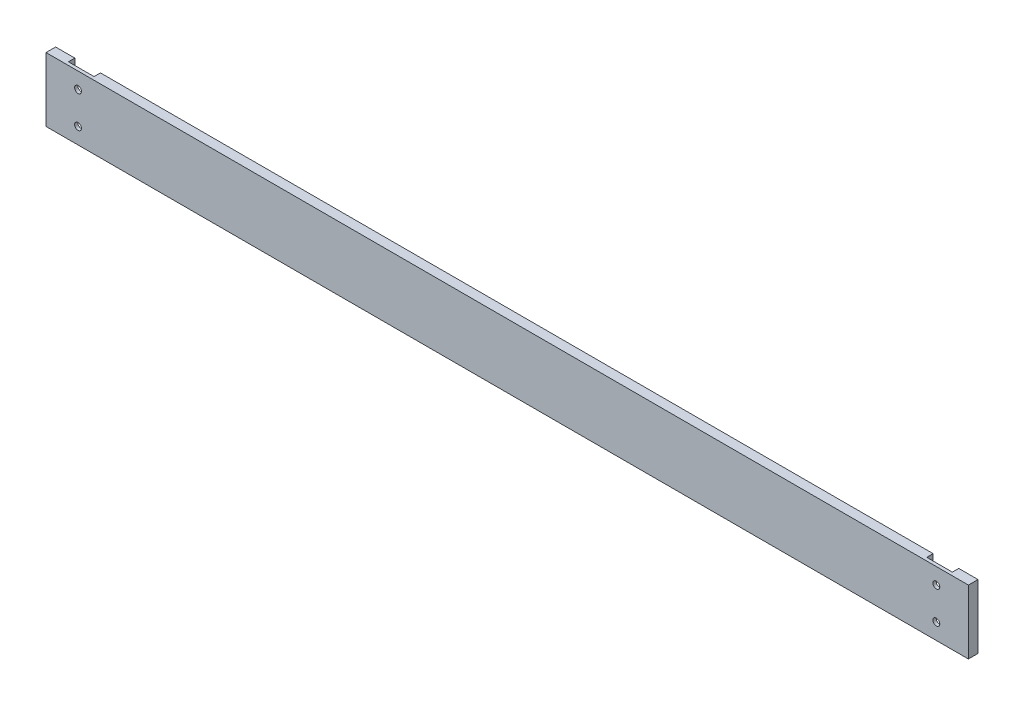
ISO-10303-21;
HEADER;
FILE_DESCRIPTION(('STEP AP214'),'2;1');
FILE_NAME('part.step','',(''),(''),'','','');
FILE_SCHEMA(('AUTOMOTIVE_DESIGN { 1 0 10303 214 1 1 1 1 }'));
ENDSEC;
DATA;
#1=APPLICATION_CONTEXT('core data for automotive mechanical design processes');
#2=APPLICATION_PROTOCOL_DEFINITION('international standard','automotive_design',2000,#1);
#3=PRODUCT_CONTEXT('',#1,'mechanical');
#4=PRODUCT('Part','Part','',(#3));
#5=PRODUCT_RELATED_PRODUCT_CATEGORY('part','',(#4));
#6=PRODUCT_DEFINITION_FORMATION('','',#4);
#7=PRODUCT_DEFINITION_CONTEXT('part definition',#1,'design');
#8=PRODUCT_DEFINITION('design','',#6,#7);
#9=PRODUCT_DEFINITION_SHAPE('','',#8);
#10=(LENGTH_UNIT() NAMED_UNIT(*) SI_UNIT(.MILLI.,.METRE.));
#11=(NAMED_UNIT(*) PLANE_ANGLE_UNIT() SI_UNIT($,.RADIAN.));
#12=(NAMED_UNIT(*) SI_UNIT($,.STERADIAN.) SOLID_ANGLE_UNIT());
#13=UNCERTAINTY_MEASURE_WITH_UNIT(LENGTH_MEASURE(1.E-05),#10,'distance_accuracy_value','');
#14=(GEOMETRIC_REPRESENTATION_CONTEXT(3) GLOBAL_UNCERTAINTY_ASSIGNED_CONTEXT((#13)) GLOBAL_UNIT_ASSIGNED_CONTEXT((#10,
#11,#12)) REPRESENTATION_CONTEXT('',''));
#15=CARTESIAN_POINT('',(0.,0.,0.));
#16=DIRECTION('',(0.,0.,1.));
#17=DIRECTION('',(1.,0.,0.));
#18=AXIS2_PLACEMENT_3D('',#15,#16,#17);
#19=CARTESIAN_POINT('',(-457.2,63.5,-9.52500000000001));
#20=DIRECTION('',(0.,0.,-1.));
#21=DIRECTION('',(-1.,0.,0.));
#22=AXIS2_PLACEMENT_3D('',#19,#20,#21);
#23=PLANE('',#22);
#24=DIRECTION('',(1.,0.,0.));
#25=VECTOR('',#24,1.);
#26=CARTESIAN_POINT('',(-457.2,0.,-9.52500000000001));
#27=LINE('',#26,#25);
#28=CARTESIAN_POINT('',(-412.75,0.,-9.525));
#29=VERTEX_POINT('',#28);
#30=CARTESIAN_POINT('',(412.75,0.,-9.525));
#31=VERTEX_POINT('',#30);
#32=EDGE_CURVE('E221',#29,#31,#27,.T.);
#33=ORIENTED_EDGE('',*,*,#32,.F.);
#34=DIRECTION('',(0.,1.,0.));
#35=VECTOR('',#34,1.);
#36=CARTESIAN_POINT('',(-412.75,0.,-9.525));
#37=LINE('',#36,#35);
#38=CARTESIAN_POINT('',(-412.75,63.5,-9.525));
#39=VERTEX_POINT('',#38);
#40=EDGE_CURVE('E256',#29,#39,#37,.T.);
#41=ORIENTED_EDGE('',*,*,#40,.T.);
#42=DIRECTION('',(1.,0.,0.));
#43=VECTOR('',#42,1.);
#44=CARTESIAN_POINT('',(-457.2,63.5,-9.52500000000001));
#45=LINE('',#44,#43);
#46=CARTESIAN_POINT('',(412.75,63.5,-9.525));
#47=VERTEX_POINT('',#46);
#48=EDGE_CURVE('E211',#39,#47,#45,.T.);
#49=ORIENTED_EDGE('',*,*,#48,.T.);
#50=DIRECTION('',(0.,1.,0.));
#51=VECTOR('',#50,1.);
#52=CARTESIAN_POINT('',(412.75,0.,-9.525));
#53=LINE('',#52,#51);
#54=EDGE_CURVE('E173',#31,#47,#53,.T.);
#55=ORIENTED_EDGE('',*,*,#54,.F.);
#56=EDGE_LOOP('',(#33,#41,#49,#55));
#57=FACE_BOUND('',#56,.T.);
#58=ADVANCED_FACE('F38',(#57),#23,.T.);
#59=CARTESIAN_POINT('',(-457.2,63.5,-9.52500000000001));
#60=VERTEX_POINT('',#59);
#61=CARTESIAN_POINT('',(-438.15,63.5,-9.525));
#62=VERTEX_POINT('',#61);
#63=EDGE_CURVE('E207',#60,#62,#45,.T.);
#64=ORIENTED_EDGE('',*,*,#63,.T.);
#65=DIRECTION('',(0.,-1.,0.));
#66=VECTOR('',#65,1.);
#67=CARTESIAN_POINT('',(-438.15,0.,-9.525));
#68=LINE('',#67,#66);
#69=CARTESIAN_POINT('',(-438.15,0.,-9.525));
#70=VERTEX_POINT('',#69);
#71=EDGE_CURVE('E238',#62,#70,#68,.T.);
#72=ORIENTED_EDGE('',*,*,#71,.T.);
#73=CARTESIAN_POINT('',(-457.2,0.,-9.52500000000001));
#74=VERTEX_POINT('',#73);
#75=EDGE_CURVE('E151',#74,#70,#27,.T.);
#76=ORIENTED_EDGE('',*,*,#75,.F.);
#77=DIRECTION('',(0.,-1.,0.));
#78=VECTOR('',#77,1.);
#79=CARTESIAN_POINT('',(-457.2,63.5,-9.52500000000001));
#80=LINE('',#79,#78);
#81=EDGE_CURVE('E42',#60,#74,#80,.T.);
#82=ORIENTED_EDGE('',*,*,#81,.F.);
#83=EDGE_LOOP('',(#64,#72,#76,#82));
#84=FACE_BOUND('',#83,.T.);
#85=ADVANCED_FACE('F237',(#84),#23,.T.);
#86=CARTESIAN_POINT('',(0.,63.5,0.));
#87=DIRECTION('',(0.,-1.,0.));
#88=DIRECTION('',(0.,0.,-1.));
#89=AXIS2_PLACEMENT_3D('',#86,#87,#88);
#90=PLANE('',#89);
#91=DIRECTION('',(0.,0.,-1.));
#92=VECTOR('',#91,1.);
#93=CARTESIAN_POINT('',(-412.75,63.5,-3.175));
#94=LINE('',#93,#92);
#95=CARTESIAN_POINT('',(-412.75,63.5,-3.175));
#96=VERTEX_POINT('',#95);
#97=EDGE_CURVE('E154',#96,#39,#94,.T.);
#98=ORIENTED_EDGE('',*,*,#97,.F.);
#99=DIRECTION('',(-1.,0.,0.));
#100=VECTOR('',#99,1.);
#101=CARTESIAN_POINT('',(-412.75,63.5,-3.175));
#102=LINE('',#101,#100);
#103=CARTESIAN_POINT('',(-438.15,63.5,-3.175));
#104=VERTEX_POINT('',#103);
#105=EDGE_CURVE('E139',#96,#104,#102,.T.);
#106=ORIENTED_EDGE('',*,*,#105,.T.);
#107=DIRECTION('',(0.,0.,-1.));
#108=VECTOR('',#107,1.);
#109=CARTESIAN_POINT('',(-438.15,63.5,-3.175));
#110=LINE('',#109,#108);
#111=EDGE_CURVE('E137',#104,#62,#110,.T.);
#112=ORIENTED_EDGE('',*,*,#111,.T.);
#113=ORIENTED_EDGE('',*,*,#63,.F.);
#114=DIRECTION('',(0.,0.,-1.));
#115=VECTOR('',#114,1.);
#116=CARTESIAN_POINT('',(-457.2,63.5,0.));
#117=LINE('',#116,#115);
#118=CARTESIAN_POINT('',(-457.2,63.5,0.));
#119=VERTEX_POINT('',#118);
#120=EDGE_CURVE('E202',#119,#60,#117,.T.);
#121=ORIENTED_EDGE('',*,*,#120,.F.);
#122=DIRECTION('',(1.,0.,0.));
#123=VECTOR('',#122,1.);
#124=CARTESIAN_POINT('',(-457.2,63.5,0.));
#125=LINE('',#124,#123);
#126=CARTESIAN_POINT('',(457.2,63.5,0.));
#127=VERTEX_POINT('',#126);
#128=EDGE_CURVE('E214',#119,#127,#125,.T.);
#129=ORIENTED_EDGE('',*,*,#128,.T.);
#130=DIRECTION('',(0.,0.,-1.));
#131=VECTOR('',#130,1.);
#132=CARTESIAN_POINT('',(457.2,63.5,0.));
#133=LINE('',#132,#131);
#134=CARTESIAN_POINT('',(457.2,63.5,-9.52500000000001));
#135=VERTEX_POINT('',#134);
#136=EDGE_CURVE('E210',#127,#135,#133,.T.);
#137=ORIENTED_EDGE('',*,*,#136,.T.);
#138=CARTESIAN_POINT('',(438.15,63.5,-9.525));
#139=VERTEX_POINT('',#138);
#140=EDGE_CURVE('E205',#139,#135,#45,.T.);
#141=ORIENTED_EDGE('',*,*,#140,.F.);
#142=DIRECTION('',(0.,0.,-1.));
#143=VECTOR('',#142,1.);
#144=CARTESIAN_POINT('',(438.15,63.5,-3.175));
#145=LINE('',#144,#143);
#146=CARTESIAN_POINT('',(438.15,63.5,-3.175));
#147=VERTEX_POINT('',#146);
#148=EDGE_CURVE('E197',#147,#139,#145,.T.);
#149=ORIENTED_EDGE('',*,*,#148,.F.);
#150=DIRECTION('',(1.,0.,0.));
#151=VECTOR('',#150,1.);
#152=CARTESIAN_POINT('',(412.75,63.5,-3.175));
#153=LINE('',#152,#151);
#154=CARTESIAN_POINT('',(412.75,63.5,-3.175));
#155=VERTEX_POINT('',#154);
#156=EDGE_CURVE('E178',#155,#147,#153,.T.);
#157=ORIENTED_EDGE('',*,*,#156,.F.);
#158=DIRECTION('',(0.,0.,-1.));
#159=VECTOR('',#158,1.);
#160=CARTESIAN_POINT('',(412.75,63.5,-3.175));
#161=LINE('',#160,#159);
#162=EDGE_CURVE('E185',#155,#47,#161,.T.);
#163=ORIENTED_EDGE('',*,*,#162,.T.);
#164=ORIENTED_EDGE('',*,*,#48,.F.);
#165=EDGE_LOOP('',(#98,#106,#112,#113,#121,#129,#137,#141,#149,#157,#163,#164));
#166=FACE_BOUND('',#165,.T.);
#167=ADVANCED_FACE('F251',(#166),#90,.F.);
#168=CARTESIAN_POINT('',(0.,0.,0.));
#169=DIRECTION('',(0.,-1.,0.));
#170=DIRECTION('',(0.,0.,-1.));
#171=AXIS2_PLACEMENT_3D('',#168,#169,#170);
#172=PLANE('',#171);
#173=DIRECTION('',(1.,0.,0.));
#174=VECTOR('',#173,1.);
#175=CARTESIAN_POINT('',(-412.75,0.,-3.175));
#176=LINE('',#175,#174);
#177=CARTESIAN_POINT('',(-438.15,0.,-3.175));
#178=VERTEX_POINT('',#177);
#179=CARTESIAN_POINT('',(-412.75,0.,-3.175));
#180=VERTEX_POINT('',#179);
#181=EDGE_CURVE('E140',#178,#180,#176,.T.);
#182=ORIENTED_EDGE('',*,*,#181,.T.);
#183=DIRECTION('',(0.,0.,-1.));
#184=VECTOR('',#183,1.);
#185=CARTESIAN_POINT('',(-412.75,0.,-3.175));
#186=LINE('',#185,#184);
#187=EDGE_CURVE('E152',#180,#29,#186,.T.);
#188=ORIENTED_EDGE('',*,*,#187,.T.);
#189=ORIENTED_EDGE('',*,*,#32,.T.);
#190=DIRECTION('',(0.,0.,-1.));
#191=VECTOR('',#190,1.);
#192=CARTESIAN_POINT('',(412.75,0.,-3.175));
#193=LINE('',#192,#191);
#194=CARTESIAN_POINT('',(412.75,0.,-3.175));
#195=VERTEX_POINT('',#194);
#196=EDGE_CURVE('E190',#195,#31,#193,.T.);
#197=ORIENTED_EDGE('',*,*,#196,.F.);
#198=DIRECTION('',(-1.,0.,0.));
#199=VECTOR('',#198,1.);
#200=CARTESIAN_POINT('',(412.75,0.,-3.175));
#201=LINE('',#200,#199);
#202=CARTESIAN_POINT('',(438.15,0.,-3.175));
#203=VERTEX_POINT('',#202);
#204=EDGE_CURVE('E183',#203,#195,#201,.T.);
#205=ORIENTED_EDGE('',*,*,#204,.F.);
#206=DIRECTION('',(0.,0.,-1.));
#207=VECTOR('',#206,1.);
#208=CARTESIAN_POINT('',(438.15,0.,-3.175));
#209=LINE('',#208,#207);
#210=CARTESIAN_POINT('',(438.15,0.,-9.525));
#211=VERTEX_POINT('',#210);
#212=EDGE_CURVE('E194',#203,#211,#209,.T.);
#213=ORIENTED_EDGE('',*,*,#212,.T.);
#214=CARTESIAN_POINT('',(457.2,0.,-9.52500000000001));
#215=VERTEX_POINT('',#214);
#216=EDGE_CURVE('E218',#211,#215,#27,.T.);
#217=ORIENTED_EDGE('',*,*,#216,.T.);
#218=DIRECTION('',(0.,0.,-1.));
#219=VECTOR('',#218,1.);
#220=CARTESIAN_POINT('',(457.2,0.,0.));
#221=LINE('',#220,#219);
#222=CARTESIAN_POINT('',(457.2,0.,0.));
#223=VERTEX_POINT('',#222);
#224=EDGE_CURVE('E220',#223,#215,#221,.T.);
#225=ORIENTED_EDGE('',*,*,#224,.F.);
#226=DIRECTION('',(1.,0.,0.));
#227=VECTOR('',#226,1.);
#228=CARTESIAN_POINT('',(-457.2,0.,0.));
#229=LINE('',#228,#227);
#230=CARTESIAN_POINT('',(-457.2,0.,0.));
#231=VERTEX_POINT('',#230);
#232=EDGE_CURVE('E206',#231,#223,#229,.T.);
#233=ORIENTED_EDGE('',*,*,#232,.F.);
#234=DIRECTION('',(0.,0.,-1.));
#235=VECTOR('',#234,1.);
#236=CARTESIAN_POINT('',(-457.2,0.,0.));
#237=LINE('',#236,#235);
#238=EDGE_CURVE('E193',#231,#74,#237,.T.);
#239=ORIENTED_EDGE('',*,*,#238,.T.);
#240=ORIENTED_EDGE('',*,*,#75,.T.);
#241=DIRECTION('',(0.,0.,-1.));
#242=VECTOR('',#241,1.);
#243=CARTESIAN_POINT('',(-438.15,0.,-3.175));
#244=LINE('',#243,#242);
#245=EDGE_CURVE('E134',#178,#70,#244,.T.);
#246=ORIENTED_EDGE('',*,*,#245,.F.);
#247=EDGE_LOOP('',(#182,#188,#189,#197,#205,#213,#217,#225,#233,#239,#240,#246));
#248=FACE_BOUND('',#247,.T.);
#249=ADVANCED_FACE('F148',(#248),#172,.T.);
#250=CARTESIAN_POINT('',(-457.2,63.5,0.));
#251=DIRECTION('',(-1.,0.,0.));
#252=DIRECTION('',(0.,0.,1.));
#253=AXIS2_PLACEMENT_3D('',#250,#251,#252);
#254=PLANE('',#253);
#255=ORIENTED_EDGE('',*,*,#238,.F.);
#256=DIRECTION('',(0.,-1.,0.));
#257=VECTOR('',#256,1.);
#258=CARTESIAN_POINT('',(-457.2,63.5,0.));
#259=LINE('',#258,#257);
#260=EDGE_CURVE('E11',#119,#231,#259,.T.);
#261=ORIENTED_EDGE('',*,*,#260,.F.);
#262=ORIENTED_EDGE('',*,*,#120,.T.);
#263=ORIENTED_EDGE('',*,*,#81,.T.);
#264=EDGE_LOOP('',(#255,#261,#262,#263));
#265=FACE_BOUND('',#264,.T.);
#266=ADVANCED_FACE('F40',(#265),#254,.T.);
#267=CARTESIAN_POINT('',(-457.2,63.5,0.));
#268=DIRECTION('',(0.,0.,-1.));
#269=DIRECTION('',(-1.,0.,0.));
#270=AXIS2_PLACEMENT_3D('',#267,#268,#269);
#271=PLANE('',#270);
#272=CARTESIAN_POINT('',(-425.45,15.875,0.));
#273=DIRECTION('',(0.,0.,1.));
#274=DIRECTION('',(1.,0.,0.));
#275=AXIS2_PLACEMENT_3D('',#272,#273,#274);
#276=CIRCLE('',#275,3.3782);
#277=CARTESIAN_POINT('',(-422.0718,15.875,0.));
#278=VERTEX_POINT('',#277);
#279=EDGE_CURVE('E424',#278,#278,#276,.T.);
#280=ORIENTED_EDGE('',*,*,#279,.F.);
#281=EDGE_LOOP('',(#280));
#282=FACE_BOUND('',#281,.T.);
#283=CARTESIAN_POINT('',(-425.45,47.625,0.));
#284=DIRECTION('',(0.,0.,1.));
#285=DIRECTION('',(1.,0.,0.));
#286=AXIS2_PLACEMENT_3D('',#283,#284,#285);
#287=CIRCLE('',#286,3.3782);
#288=CARTESIAN_POINT('',(-422.0718,47.625,0.));
#289=VERTEX_POINT('',#288);
#290=EDGE_CURVE('E428',#289,#289,#287,.T.);
#291=ORIENTED_EDGE('',*,*,#290,.F.);
#292=EDGE_LOOP('',(#291));
#293=FACE_BOUND('',#292,.T.);
#294=CARTESIAN_POINT('',(425.45,15.875,0.));
#295=DIRECTION('',(0.,0.,1.));
#296=DIRECTION('',(1.,0.,0.));
#297=AXIS2_PLACEMENT_3D('',#294,#295,#296);
#298=CIRCLE('',#297,3.3782);
#299=CARTESIAN_POINT('',(428.8282,15.875,0.));
#300=VERTEX_POINT('',#299);
#301=EDGE_CURVE('E159',#300,#300,#298,.T.);
#302=ORIENTED_EDGE('',*,*,#301,.F.);
#303=EDGE_LOOP('',(#302));
#304=FACE_BOUND('',#303,.T.);
#305=CARTESIAN_POINT('',(425.45,47.625,0.));
#306=DIRECTION('',(0.,0.,1.));
#307=DIRECTION('',(1.,0.,0.));
#308=AXIS2_PLACEMENT_3D('',#305,#306,#307);
#309=CIRCLE('',#308,3.3782);
#310=CARTESIAN_POINT('',(428.8282,47.625,0.));
#311=VERTEX_POINT('',#310);
#312=EDGE_CURVE('E165',#311,#311,#309,.T.);
#313=ORIENTED_EDGE('',*,*,#312,.F.);
#314=EDGE_LOOP('',(#313));
#315=FACE_BOUND('',#314,.T.);
#316=ORIENTED_EDGE('',*,*,#232,.T.);
#317=DIRECTION('',(0.,-1.,0.));
#318=VECTOR('',#317,1.);
#319=CARTESIAN_POINT('',(457.2,63.5,0.));
#320=LINE('',#319,#318);
#321=EDGE_CURVE('E47',#127,#223,#320,.T.);
#322=ORIENTED_EDGE('',*,*,#321,.F.);
#323=ORIENTED_EDGE('',*,*,#128,.F.);
#324=ORIENTED_EDGE('',*,*,#260,.T.);
#325=EDGE_LOOP('',(#316,#322,#323,#324));
#326=FACE_BOUND('',#325,.T.);
#327=ADVANCED_FACE('F243',(#282,#293,#304,#315,#326),#271,.F.);
#328=CARTESIAN_POINT('',(457.2,63.5,0.));
#329=DIRECTION('',(-1.,0.,0.));
#330=DIRECTION('',(0.,0.,1.));
#331=AXIS2_PLACEMENT_3D('',#328,#329,#330);
#332=PLANE('',#331);
#333=ORIENTED_EDGE('',*,*,#224,.T.);
#334=DIRECTION('',(0.,-1.,0.));
#335=VECTOR('',#334,1.);
#336=CARTESIAN_POINT('',(457.2,63.5,-9.52500000000001));
#337=LINE('',#336,#335);
#338=EDGE_CURVE('E227',#135,#215,#337,.T.);
#339=ORIENTED_EDGE('',*,*,#338,.F.);
#340=ORIENTED_EDGE('',*,*,#136,.F.);
#341=ORIENTED_EDGE('',*,*,#321,.T.);
#342=EDGE_LOOP('',(#333,#339,#340,#341));
#343=FACE_BOUND('',#342,.T.);
#344=ADVANCED_FACE('F247',(#343),#332,.F.);
#345=DIRECTION('',(0.,-1.,0.));
#346=VECTOR('',#345,1.);
#347=CARTESIAN_POINT('',(438.15,0.,-9.525));
#348=LINE('',#347,#346);
#349=EDGE_CURVE('E179',#139,#211,#348,.T.);
#350=ORIENTED_EDGE('',*,*,#349,.F.);
#351=ORIENTED_EDGE('',*,*,#140,.T.);
#352=ORIENTED_EDGE('',*,*,#338,.T.);
#353=ORIENTED_EDGE('',*,*,#216,.F.);
#354=EDGE_LOOP('',(#350,#351,#352,#353));
#355=FACE_BOUND('',#354,.T.);
#356=ADVANCED_FACE('F268',(#355),#23,.T.);
#357=CARTESIAN_POINT('',(412.75,0.,-3.175));
#358=DIRECTION('',(-1.,0.,0.));
#359=DIRECTION('',(0.,-1.,0.));
#360=AXIS2_PLACEMENT_3D('',#357,#358,#359);
#361=PLANE('',#360);
#362=ORIENTED_EDGE('',*,*,#54,.T.);
#363=ORIENTED_EDGE('',*,*,#162,.F.);
#364=DIRECTION('',(0.,1.,0.));
#365=VECTOR('',#364,1.);
#366=CARTESIAN_POINT('',(412.75,0.,-3.175));
#367=LINE('',#366,#365);
#368=EDGE_CURVE('E174',#195,#155,#367,.T.);
#369=ORIENTED_EDGE('',*,*,#368,.F.);
#370=ORIENTED_EDGE('',*,*,#196,.T.);
#371=EDGE_LOOP('',(#362,#363,#369,#370));
#372=FACE_BOUND('',#371,.T.);
#373=ADVANCED_FACE('F275',(#372),#361,.F.);
#374=CARTESIAN_POINT('',(438.15,0.,-3.175));
#375=DIRECTION('',(1.,0.,0.));
#376=DIRECTION('',(0.,0.,-1.));
#377=AXIS2_PLACEMENT_3D('',#374,#375,#376);
#378=PLANE('',#377);
#379=ORIENTED_EDGE('',*,*,#349,.T.);
#380=ORIENTED_EDGE('',*,*,#212,.F.);
#381=DIRECTION('',(0.,-1.,0.));
#382=VECTOR('',#381,1.);
#383=CARTESIAN_POINT('',(438.15,0.,-3.175));
#384=LINE('',#383,#382);
#385=EDGE_CURVE('E63',#147,#203,#384,.T.);
#386=ORIENTED_EDGE('',*,*,#385,.F.);
#387=ORIENTED_EDGE('',*,*,#148,.T.);
#388=EDGE_LOOP('',(#379,#380,#386,#387));
#389=FACE_BOUND('',#388,.T.);
#390=ADVANCED_FACE('F270',(#389),#378,.F.);
#391=CARTESIAN_POINT('',(0.,0.,-3.175));
#392=DIRECTION('',(0.,0.,-1.));
#393=DIRECTION('',(-1.,0.,0.));
#394=AXIS2_PLACEMENT_3D('',#391,#392,#393);
#395=PLANE('',#394);
#396=CARTESIAN_POINT('',(425.45,15.875,-3.175));
#397=DIRECTION('',(0.,0.,-1.));
#398=DIRECTION('',(-1.,0.,0.));
#399=AXIS2_PLACEMENT_3D('',#396,#397,#398);
#400=CIRCLE('',#399,3.3782);
#401=CARTESIAN_POINT('',(422.0718,15.875,-3.175));
#402=VERTEX_POINT('',#401);
#403=EDGE_CURVE('E162',#402,#402,#400,.T.);
#404=ORIENTED_EDGE('',*,*,#403,.F.);
#405=EDGE_LOOP('',(#404));
#406=FACE_BOUND('',#405,.T.);
#407=CARTESIAN_POINT('',(425.45,47.625,-3.175));
#408=DIRECTION('',(0.,0.,-1.));
#409=DIRECTION('',(-1.,0.,0.));
#410=AXIS2_PLACEMENT_3D('',#407,#408,#409);
#411=CIRCLE('',#410,3.3782);
#412=CARTESIAN_POINT('',(422.0718,47.625,-3.175));
#413=VERTEX_POINT('',#412);
#414=EDGE_CURVE('E169',#413,#413,#411,.T.);
#415=ORIENTED_EDGE('',*,*,#414,.F.);
#416=EDGE_LOOP('',(#415));
#417=FACE_BOUND('',#416,.T.);
#418=ORIENTED_EDGE('',*,*,#368,.T.);
#419=ORIENTED_EDGE('',*,*,#156,.T.);
#420=ORIENTED_EDGE('',*,*,#385,.T.);
#421=ORIENTED_EDGE('',*,*,#204,.T.);
#422=EDGE_LOOP('',(#418,#419,#420,#421));
#423=FACE_BOUND('',#422,.T.);
#424=ADVANCED_FACE('F273',(#406,#417,#423),#395,.T.);
#425=CARTESIAN_POINT('',(425.45,47.625,0.));
#426=DIRECTION('',(0.,0.,1.));
#427=DIRECTION('',(1.,0.,0.));
#428=AXIS2_PLACEMENT_3D('',#425,#426,#427);
#429=CYLINDRICAL_SURFACE('',#428,3.3782);
#430=ORIENTED_EDGE('',*,*,#312,.T.);
#431=EDGE_LOOP('',(#430));
#432=FACE_BOUND('',#431,.T.);
#433=ORIENTED_EDGE('',*,*,#414,.T.);
#434=EDGE_LOOP('',(#433));
#435=FACE_BOUND('',#434,.T.);
#436=ADVANCED_FACE('F337',(#432,#435),#429,.F.);
#437=CARTESIAN_POINT('',(425.45,15.875,0.));
#438=DIRECTION('',(0.,0.,1.));
#439=DIRECTION('',(1.,0.,0.));
#440=AXIS2_PLACEMENT_3D('',#437,#438,#439);
#441=CYLINDRICAL_SURFACE('',#440,3.3782);
#442=ORIENTED_EDGE('',*,*,#301,.T.);
#443=EDGE_LOOP('',(#442));
#444=FACE_BOUND('',#443,.T.);
#445=ORIENTED_EDGE('',*,*,#403,.T.);
#446=EDGE_LOOP('',(#445));
#447=FACE_BOUND('',#446,.T.);
#448=ADVANCED_FACE('F342',(#444,#447),#441,.F.);
#449=CARTESIAN_POINT('',(-412.75,0.,-3.175));
#450=DIRECTION('',(-1.,0.,0.));
#451=DIRECTION('',(0.,-1.,0.));
#452=AXIS2_PLACEMENT_3D('',#449,#450,#451);
#453=PLANE('',#452);
#454=ORIENTED_EDGE('',*,*,#40,.F.);
#455=ORIENTED_EDGE('',*,*,#187,.F.);
#456=DIRECTION('',(0.,1.,0.));
#457=VECTOR('',#456,1.);
#458=CARTESIAN_POINT('',(-412.75,0.,-3.175));
#459=LINE('',#458,#457);
#460=EDGE_CURVE('E55',#180,#96,#459,.T.);
#461=ORIENTED_EDGE('',*,*,#460,.T.);
#462=ORIENTED_EDGE('',*,*,#97,.T.);
#463=EDGE_LOOP('',(#454,#455,#461,#462));
#464=FACE_BOUND('',#463,.T.);
#465=ADVANCED_FACE('F261',(#464),#453,.T.);
#466=CARTESIAN_POINT('',(-438.15,0.,-3.175));
#467=DIRECTION('',(1.,0.,0.));
#468=DIRECTION('',(0.,0.,-1.));
#469=AXIS2_PLACEMENT_3D('',#466,#467,#468);
#470=PLANE('',#469);
#471=ORIENTED_EDGE('',*,*,#71,.F.);
#472=ORIENTED_EDGE('',*,*,#111,.F.);
#473=DIRECTION('',(0.,-1.,0.));
#474=VECTOR('',#473,1.);
#475=CARTESIAN_POINT('',(-438.15,0.,-3.175));
#476=LINE('',#475,#474);
#477=EDGE_CURVE('E131',#104,#178,#476,.T.);
#478=ORIENTED_EDGE('',*,*,#477,.T.);
#479=ORIENTED_EDGE('',*,*,#245,.T.);
#480=EDGE_LOOP('',(#471,#472,#478,#479));
#481=FACE_BOUND('',#480,.T.);
#482=ADVANCED_FACE('F132',(#481),#470,.T.);
#483=CARTESIAN_POINT('',(0.,0.,-3.175));
#484=DIRECTION('',(0.,0.,-1.));
#485=DIRECTION('',(1.,0.,0.));
#486=AXIS2_PLACEMENT_3D('',#483,#484,#485);
#487=PLANE('',#486);
#488=CARTESIAN_POINT('',(-425.45,15.875,-3.175));
#489=DIRECTION('',(0.,0.,-1.));
#490=DIRECTION('',(-1.,0.,0.));
#491=AXIS2_PLACEMENT_3D('',#488,#489,#490);
#492=CIRCLE('',#491,3.3782);
#493=CARTESIAN_POINT('',(-428.8282,15.875,-3.175));
#494=VERTEX_POINT('',#493);
#495=EDGE_CURVE('E427',#494,#494,#492,.T.);
#496=ORIENTED_EDGE('',*,*,#495,.F.);
#497=EDGE_LOOP('',(#496));
#498=FACE_BOUND('',#497,.T.);
#499=CARTESIAN_POINT('',(-425.45,47.625,-3.175));
#500=DIRECTION('',(0.,0.,-1.));
#501=DIRECTION('',(-1.,0.,0.));
#502=AXIS2_PLACEMENT_3D('',#499,#500,#501);
#503=CIRCLE('',#502,3.3782);
#504=CARTESIAN_POINT('',(-428.8282,47.625,-3.175));
#505=VERTEX_POINT('',#504);
#506=EDGE_CURVE('E259',#505,#505,#503,.T.);
#507=ORIENTED_EDGE('',*,*,#506,.F.);
#508=EDGE_LOOP('',(#507));
#509=FACE_BOUND('',#508,.T.);
#510=ORIENTED_EDGE('',*,*,#460,.F.);
#511=ORIENTED_EDGE('',*,*,#181,.F.);
#512=ORIENTED_EDGE('',*,*,#477,.F.);
#513=ORIENTED_EDGE('',*,*,#105,.F.);
#514=EDGE_LOOP('',(#510,#511,#512,#513));
#515=FACE_BOUND('',#514,.T.);
#516=ADVANCED_FACE('F143',(#498,#509,#515),#487,.T.);
#517=CARTESIAN_POINT('',(-425.45,47.625,0.));
#518=DIRECTION('',(0.,0.,1.));
#519=DIRECTION('',(1.,0.,0.));
#520=AXIS2_PLACEMENT_3D('',#517,#518,#519);
#521=CYLINDRICAL_SURFACE('',#520,3.3782);
#522=ORIENTED_EDGE('',*,*,#290,.T.);
#523=EDGE_LOOP('',(#522));
#524=FACE_BOUND('',#523,.T.);
#525=ORIENTED_EDGE('',*,*,#506,.T.);
#526=EDGE_LOOP('',(#525));
#527=FACE_BOUND('',#526,.T.);
#528=ADVANCED_FACE('F396',(#524,#527),#521,.F.);
#529=CARTESIAN_POINT('',(-425.45,15.875,0.));
#530=DIRECTION('',(0.,0.,1.));
#531=DIRECTION('',(1.,0.,0.));
#532=AXIS2_PLACEMENT_3D('',#529,#530,#531);
#533=CYLINDRICAL_SURFACE('',#532,3.3782);
#534=ORIENTED_EDGE('',*,*,#279,.T.);
#535=EDGE_LOOP('',(#534));
#536=FACE_BOUND('',#535,.T.);
#537=ORIENTED_EDGE('',*,*,#495,.T.);
#538=EDGE_LOOP('',(#537));
#539=FACE_BOUND('',#538,.T.);
#540=ADVANCED_FACE('F405',(#536,#539),#533,.F.);
#541=CLOSED_SHELL('',(#58,#85,#167,#249,#266,#327,#344,#356,#373,#390,#424,#436,#448,#465,#482,
#516,#528,#540));
#542=MANIFOLD_SOLID_BREP('B2',#541);
#543=ADVANCED_BREP_SHAPE_REPRESENTATION('',(#18,#542),#14);
#544=SHAPE_DEFINITION_REPRESENTATION(#9,#543);
ENDSEC;
END-ISO-10303-21;
